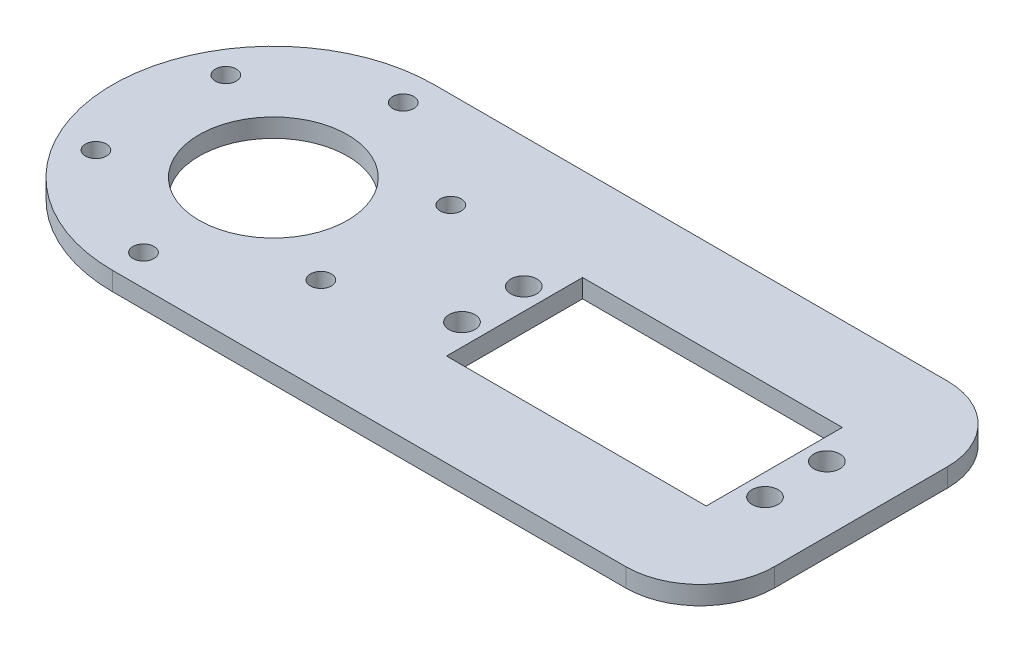
ISO-10303-21;
HEADER;
FILE_DESCRIPTION(('STEP AP214'),'2;1');
FILE_NAME('part.step','',(''),(''),'','','');
FILE_SCHEMA(('AUTOMOTIVE_DESIGN { 1 0 10303 214 1 1 1 1 }'));
ENDSEC;
DATA;
#1=APPLICATION_CONTEXT('core data for automotive mechanical design processes');
#2=APPLICATION_PROTOCOL_DEFINITION('international standard','automotive_design',2000,#1);
#3=PRODUCT_CONTEXT('',#1,'mechanical');
#4=PRODUCT('Part','Part','',(#3));
#5=PRODUCT_RELATED_PRODUCT_CATEGORY('part','',(#4));
#6=PRODUCT_DEFINITION_FORMATION('','',#4);
#7=PRODUCT_DEFINITION_CONTEXT('part definition',#1,'design');
#8=PRODUCT_DEFINITION('design','',#6,#7);
#9=PRODUCT_DEFINITION_SHAPE('','',#8);
#10=(LENGTH_UNIT() NAMED_UNIT(*) SI_UNIT(.MILLI.,.METRE.));
#11=(NAMED_UNIT(*) PLANE_ANGLE_UNIT() SI_UNIT($,.RADIAN.));
#12=(NAMED_UNIT(*) SI_UNIT($,.STERADIAN.) SOLID_ANGLE_UNIT());
#13=UNCERTAINTY_MEASURE_WITH_UNIT(LENGTH_MEASURE(1.E-05),#10,'distance_accuracy_value','');
#14=(GEOMETRIC_REPRESENTATION_CONTEXT(3) GLOBAL_UNCERTAINTY_ASSIGNED_CONTEXT((#13)) GLOBAL_UNIT_ASSIGNED_CONTEXT((#10,
#11,#12)) REPRESENTATION_CONTEXT('',''));
#15=CARTESIAN_POINT('',(0.,0.,0.));
#16=DIRECTION('',(0.,0.,1.));
#17=DIRECTION('',(1.,0.,0.));
#18=AXIS2_PLACEMENT_3D('',#15,#16,#17);
#19=CARTESIAN_POINT('',(0.,3.,0.));
#20=DIRECTION('',(0.,1.,0.));
#21=DIRECTION('',(0.,0.,1.));
#22=AXIS2_PLACEMENT_3D('',#19,#20,#21);
#23=PLANE('',#22);
#24=CARTESIAN_POINT('',(18.1865334794732,3.,-10.5));
#25=DIRECTION('',(0.,1.,0.));
#26=DIRECTION('',(0.,0.,1.));
#27=AXIS2_PLACEMENT_3D('',#24,#25,#26);
#28=CIRCLE('',#27,1.7);
#29=CARTESIAN_POINT('',(18.1865334794732,3.,-8.80000000000002));
#30=VERTEX_POINT('',#29);
#31=EDGE_CURVE('E466',#30,#30,#28,.T.);
#32=ORIENTED_EDGE('',*,*,#31,.F.);
#33=EDGE_LOOP('',(#32));
#34=FACE_BOUND('',#33,.T.);
#35=CARTESIAN_POINT('',(-18.1865334794732,3.,-10.5));
#36=DIRECTION('',(0.,1.,0.));
#37=DIRECTION('',(0.,0.,1.));
#38=AXIS2_PLACEMENT_3D('',#35,#36,#37);
#39=CIRCLE('',#38,1.7);
#40=CARTESIAN_POINT('',(-18.1865334794732,3.,-8.8));
#41=VERTEX_POINT('',#40);
#42=EDGE_CURVE('E478',#41,#41,#39,.T.);
#43=ORIENTED_EDGE('',*,*,#42,.F.);
#44=EDGE_LOOP('',(#43));
#45=FACE_BOUND('',#44,.T.);
#46=CARTESIAN_POINT('',(84.5,3.,-5.00000000000001));
#47=DIRECTION('',(0.,1.,0.));
#48=DIRECTION('',(0.,0.,-1.));
#49=AXIS2_PLACEMENT_3D('',#46,#47,#48);
#50=CIRCLE('',#49,2.1);
#51=CARTESIAN_POINT('',(84.5,3.,-7.10000000000001));
#52=VERTEX_POINT('',#51);
#53=EDGE_CURVE('E490',#52,#52,#50,.T.);
#54=ORIENTED_EDGE('',*,*,#53,.F.);
#55=EDGE_LOOP('',(#54));
#56=FACE_BOUND('',#55,.T.);
#57=DIRECTION('',(-1.,0.,0.));
#58=VECTOR('',#57,1.);
#59=CARTESIAN_POINT('',(39.,3.,-11.));
#60=LINE('',#59,#58);
#61=CARTESIAN_POINT('',(81.,3.,-11.));
#62=VERTEX_POINT('',#61);
#63=CARTESIAN_POINT('',(39.,3.,-11.));
#64=VERTEX_POINT('',#63);
#65=EDGE_CURVE('E124',#62,#64,#60,.T.);
#66=ORIENTED_EDGE('',*,*,#65,.F.);
#67=DIRECTION('',(0.,0.,-1.));
#68=VECTOR('',#67,1.);
#69=CARTESIAN_POINT('',(81.,3.,11.));
#70=LINE('',#69,#68);
#71=CARTESIAN_POINT('',(81.,3.,11.));
#72=VERTEX_POINT('',#71);
#73=EDGE_CURVE('E114',#72,#62,#70,.T.);
#74=ORIENTED_EDGE('',*,*,#73,.F.);
#75=DIRECTION('',(1.,0.,0.));
#76=VECTOR('',#75,1.);
#77=CARTESIAN_POINT('',(39.,3.,11.));
#78=LINE('',#77,#76);
#79=CARTESIAN_POINT('',(39.,3.,11.));
#80=VERTEX_POINT('',#79);
#81=EDGE_CURVE('E140',#80,#72,#78,.T.);
#82=ORIENTED_EDGE('',*,*,#81,.F.);
#83=DIRECTION('',(0.,0.,1.));
#84=VECTOR('',#83,1.);
#85=CARTESIAN_POINT('',(39.,3.,11.));
#86=LINE('',#85,#84);
#87=EDGE_CURVE('E138',#64,#80,#86,.T.);
#88=ORIENTED_EDGE('',*,*,#87,.F.);
#89=EDGE_LOOP('',(#66,#74,#82,#88));
#90=FACE_BOUND('',#89,.T.);
#91=CARTESIAN_POINT('',(35.5,3.,5.));
#92=DIRECTION('',(0.,1.,0.));
#93=DIRECTION('',(0.,0.,1.));
#94=AXIS2_PLACEMENT_3D('',#91,#92,#93);
#95=CIRCLE('',#94,2.1);
#96=CARTESIAN_POINT('',(35.5,3.,7.1));
#97=VERTEX_POINT('',#96);
#98=EDGE_CURVE('E158',#97,#97,#95,.T.);
#99=ORIENTED_EDGE('',*,*,#98,.F.);
#100=EDGE_LOOP('',(#99));
#101=FACE_BOUND('',#100,.T.);
#102=CARTESIAN_POINT('',(0.,3.,21.));
#103=DIRECTION('',(0.,1.,0.));
#104=DIRECTION('',(0.,0.,1.));
#105=AXIS2_PLACEMENT_3D('',#102,#103,#104);
#106=CIRCLE('',#105,1.7);
#107=CARTESIAN_POINT('',(0.,3.,22.7));
#108=VERTEX_POINT('',#107);
#109=EDGE_CURVE('E170',#108,#108,#106,.T.);
#110=ORIENTED_EDGE('',*,*,#109,.F.);
#111=EDGE_LOOP('',(#110));
#112=FACE_BOUND('',#111,.T.);
#113=DIRECTION('',(0.,0.,-1.));
#114=VECTOR('',#113,1.);
#115=CARTESIAN_POINT('',(95.,3.,26.));
#116=LINE('',#115,#114);
#117=CARTESIAN_POINT('',(95.,3.,14.));
#118=VERTEX_POINT('',#117);
#119=CARTESIAN_POINT('',(95.,3.,-14.));
#120=VERTEX_POINT('',#119);
#121=EDGE_CURVE('E188',#118,#120,#116,.T.);
#122=ORIENTED_EDGE('',*,*,#121,.T.);
#123=CARTESIAN_POINT('',(83.,3.,-14.));
#124=DIRECTION('',(0.,1.,0.));
#125=DIRECTION('',(0.,0.,1.));
#126=AXIS2_PLACEMENT_3D('',#123,#124,#125);
#127=CIRCLE('',#126,12.);
#128=CARTESIAN_POINT('',(83.,3.,-26.));
#129=VERTEX_POINT('',#128);
#130=EDGE_CURVE('E43',#120,#129,#127,.T.);
#131=ORIENTED_EDGE('',*,*,#130,.T.);
#132=DIRECTION('',(-1.,0.,0.));
#133=VECTOR('',#132,1.);
#134=CARTESIAN_POINT('',(0.,3.,-26.));
#135=LINE('',#134,#133);
#136=CARTESIAN_POINT('',(0.,3.,-26.));
#137=VERTEX_POINT('',#136);
#138=EDGE_CURVE('E190',#129,#137,#135,.T.);
#139=ORIENTED_EDGE('',*,*,#138,.T.);
#140=CARTESIAN_POINT('',(0.,3.,0.));
#141=DIRECTION('',(0.,1.,0.));
#142=DIRECTION('',(0.,0.,1.));
#143=AXIS2_PLACEMENT_3D('',#140,#141,#142);
#144=CIRCLE('',#143,26.);
#145=CARTESIAN_POINT('',(0.,3.,26.));
#146=VERTEX_POINT('',#145);
#147=EDGE_CURVE('E182',#137,#146,#144,.T.);
#148=ORIENTED_EDGE('',*,*,#147,.T.);
#149=DIRECTION('',(1.,0.,0.));
#150=VECTOR('',#149,1.);
#151=CARTESIAN_POINT('',(0.,3.,26.));
#152=LINE('',#151,#150);
#153=CARTESIAN_POINT('',(83.,3.,26.));
#154=VERTEX_POINT('',#153);
#155=EDGE_CURVE('E185',#146,#154,#152,.T.);
#156=ORIENTED_EDGE('',*,*,#155,.T.);
#157=CARTESIAN_POINT('',(83.,3.,14.));
#158=DIRECTION('',(0.,1.,0.));
#159=DIRECTION('',(0.,0.,1.));
#160=AXIS2_PLACEMENT_3D('',#157,#158,#159);
#161=CIRCLE('',#160,12.);
#162=EDGE_CURVE('E216',#154,#118,#161,.T.);
#163=ORIENTED_EDGE('',*,*,#162,.T.);
#164=EDGE_LOOP('',(#122,#131,#139,#148,#156,#163));
#165=FACE_BOUND('',#164,.T.);
#166=CARTESIAN_POINT('',(0.,3.,0.));
#167=DIRECTION('',(0.,1.,0.));
#168=DIRECTION('',(0.,0.,1.));
#169=AXIS2_PLACEMENT_3D('',#166,#167,#168);
#170=CIRCLE('',#169,12.);
#171=CARTESIAN_POINT('',(0.,3.,12.));
#172=VERTEX_POINT('',#171);
#173=EDGE_CURVE('E176',#172,#172,#170,.T.);
#174=ORIENTED_EDGE('',*,*,#173,.F.);
#175=EDGE_LOOP('',(#174));
#176=FACE_BOUND('',#175,.T.);
#177=CARTESIAN_POINT('',(35.5,3.,-5.));
#178=DIRECTION('',(0.,1.,0.));
#179=DIRECTION('',(0.,0.,1.));
#180=AXIS2_PLACEMENT_3D('',#177,#178,#179);
#181=CIRCLE('',#180,2.1);
#182=CARTESIAN_POINT('',(35.5,3.,-2.9));
#183=VERTEX_POINT('',#182);
#184=EDGE_CURVE('E164',#183,#183,#181,.T.);
#185=ORIENTED_EDGE('',*,*,#184,.F.);
#186=EDGE_LOOP('',(#185));
#187=FACE_BOUND('',#186,.T.);
#188=CARTESIAN_POINT('',(84.5,3.,4.99999999999999));
#189=DIRECTION('',(0.,1.,0.));
#190=DIRECTION('',(0.,0.,-1.));
#191=AXIS2_PLACEMENT_3D('',#188,#189,#190);
#192=CIRCLE('',#191,2.1);
#193=CARTESIAN_POINT('',(84.5,3.,2.89999999999999));
#194=VERTEX_POINT('',#193);
#195=EDGE_CURVE('E147',#194,#194,#192,.T.);
#196=ORIENTED_EDGE('',*,*,#195,.F.);
#197=EDGE_LOOP('',(#196));
#198=FACE_BOUND('',#197,.T.);
#199=CARTESIAN_POINT('',(-18.1865334794732,3.,10.5));
#200=DIRECTION('',(0.,1.,0.));
#201=DIRECTION('',(0.,0.,1.));
#202=AXIS2_PLACEMENT_3D('',#199,#200,#201);
#203=CIRCLE('',#202,1.7);
#204=CARTESIAN_POINT('',(-18.1865334794732,3.,12.2));
#205=VERTEX_POINT('',#204);
#206=EDGE_CURVE('E484',#205,#205,#203,.T.);
#207=ORIENTED_EDGE('',*,*,#206,.F.);
#208=EDGE_LOOP('',(#207));
#209=FACE_BOUND('',#208,.T.);
#210=CARTESIAN_POINT('',(0.,3.,-21.));
#211=DIRECTION('',(0.,1.,0.));
#212=DIRECTION('',(0.,0.,1.));
#213=AXIS2_PLACEMENT_3D('',#210,#211,#212);
#214=CIRCLE('',#213,1.7);
#215=CARTESIAN_POINT('',(0.,3.,-19.3));
#216=VERTEX_POINT('',#215);
#217=EDGE_CURVE('E472',#216,#216,#214,.T.);
#218=ORIENTED_EDGE('',*,*,#217,.F.);
#219=EDGE_LOOP('',(#218));
#220=FACE_BOUND('',#219,.T.);
#221=CARTESIAN_POINT('',(18.1865334794732,3.,10.5));
#222=DIRECTION('',(0.,1.,0.));
#223=DIRECTION('',(0.,0.,1.));
#224=AXIS2_PLACEMENT_3D('',#221,#222,#223);
#225=CIRCLE('',#224,1.7);
#226=CARTESIAN_POINT('',(18.1865334794732,3.,12.2));
#227=VERTEX_POINT('',#226);
#228=EDGE_CURVE('E457',#227,#227,#225,.T.);
#229=ORIENTED_EDGE('',*,*,#228,.F.);
#230=EDGE_LOOP('',(#229));
#231=FACE_BOUND('',#230,.T.);
#232=ADVANCED_FACE('F35',(#34,#45,#56,#90,#101,#112,#165,#176,#187,#198,#209,#220,#231),#23,.T.);
#233=CARTESIAN_POINT('',(0.,0.,0.));
#234=DIRECTION('',(0.,1.,0.));
#235=DIRECTION('',(0.,0.,1.));
#236=AXIS2_PLACEMENT_3D('',#233,#234,#235);
#237=PLANE('',#236);
#238=CARTESIAN_POINT('',(35.5,0.,5.));
#239=DIRECTION('',(0.,1.,0.));
#240=DIRECTION('',(0.,0.,1.));
#241=AXIS2_PLACEMENT_3D('',#238,#239,#240);
#242=CIRCLE('',#241,2.1);
#243=CARTESIAN_POINT('',(35.5,0.,7.1));
#244=VERTEX_POINT('',#243);
#245=EDGE_CURVE('E132',#244,#244,#242,.T.);
#246=ORIENTED_EDGE('',*,*,#245,.T.);
#247=EDGE_LOOP('',(#246));
#248=FACE_BOUND('',#247,.T.);
#249=CARTESIAN_POINT('',(35.5,0.,-5.));
#250=DIRECTION('',(0.,1.,0.));
#251=DIRECTION('',(0.,0.,1.));
#252=AXIS2_PLACEMENT_3D('',#249,#250,#251);
#253=CIRCLE('',#252,2.1);
#254=CARTESIAN_POINT('',(35.5,0.,-2.9));
#255=VERTEX_POINT('',#254);
#256=EDGE_CURVE('E161',#255,#255,#253,.T.);
#257=ORIENTED_EDGE('',*,*,#256,.T.);
#258=EDGE_LOOP('',(#257));
#259=FACE_BOUND('',#258,.T.);
#260=CARTESIAN_POINT('',(0.,0.,21.));
#261=DIRECTION('',(0.,1.,0.));
#262=DIRECTION('',(0.,0.,1.));
#263=AXIS2_PLACEMENT_3D('',#260,#261,#262);
#264=CIRCLE('',#263,1.7);
#265=CARTESIAN_POINT('',(0.,0.,22.7));
#266=VERTEX_POINT('',#265);
#267=EDGE_CURVE('E167',#266,#266,#264,.T.);
#268=ORIENTED_EDGE('',*,*,#267,.T.);
#269=EDGE_LOOP('',(#268));
#270=FACE_BOUND('',#269,.T.);
#271=CARTESIAN_POINT('',(0.,0.,0.));
#272=DIRECTION('',(0.,1.,0.));
#273=DIRECTION('',(0.,0.,1.));
#274=AXIS2_PLACEMENT_3D('',#271,#272,#273);
#275=CIRCLE('',#274,12.);
#276=CARTESIAN_POINT('',(0.,0.,12.));
#277=VERTEX_POINT('',#276);
#278=EDGE_CURVE('E173',#277,#277,#275,.T.);
#279=ORIENTED_EDGE('',*,*,#278,.T.);
#280=EDGE_LOOP('',(#279));
#281=FACE_BOUND('',#280,.T.);
#282=DIRECTION('',(-1.,0.,0.));
#283=VECTOR('',#282,1.);
#284=CARTESIAN_POINT('',(0.,0.,-26.));
#285=LINE('',#284,#283);
#286=CARTESIAN_POINT('',(83.,0.,-26.));
#287=VERTEX_POINT('',#286);
#288=CARTESIAN_POINT('',(0.,0.,-26.));
#289=VERTEX_POINT('',#288);
#290=EDGE_CURVE('E186',#287,#289,#285,.T.);
#291=ORIENTED_EDGE('',*,*,#290,.F.);
#292=CARTESIAN_POINT('',(83.,0.,-14.));
#293=DIRECTION('',(0.,1.,0.));
#294=DIRECTION('',(0.,0.,1.));
#295=AXIS2_PLACEMENT_3D('',#292,#293,#294);
#296=CIRCLE('',#295,12.);
#297=CARTESIAN_POINT('',(95.,0.,-14.));
#298=VERTEX_POINT('',#297);
#299=EDGE_CURVE('E210',#287,#298,#296,.F.);
#300=ORIENTED_EDGE('',*,*,#299,.T.);
#301=DIRECTION('',(0.,0.,-1.));
#302=VECTOR('',#301,1.);
#303=CARTESIAN_POINT('',(95.,0.,26.));
#304=LINE('',#303,#302);
#305=CARTESIAN_POINT('',(95.,0.,14.));
#306=VERTEX_POINT('',#305);
#307=EDGE_CURVE('E197',#306,#298,#304,.T.);
#308=ORIENTED_EDGE('',*,*,#307,.F.);
#309=CARTESIAN_POINT('',(83.,0.,14.));
#310=DIRECTION('',(0.,1.,0.));
#311=DIRECTION('',(0.,0.,1.));
#312=AXIS2_PLACEMENT_3D('',#309,#310,#311);
#313=CIRCLE('',#312,12.);
#314=CARTESIAN_POINT('',(83.,0.,26.));
#315=VERTEX_POINT('',#314);
#316=EDGE_CURVE('E208',#306,#315,#313,.F.);
#317=ORIENTED_EDGE('',*,*,#316,.T.);
#318=DIRECTION('',(1.,0.,0.));
#319=VECTOR('',#318,1.);
#320=CARTESIAN_POINT('',(0.,0.,26.));
#321=LINE('',#320,#319);
#322=CARTESIAN_POINT('',(0.,0.,26.));
#323=VERTEX_POINT('',#322);
#324=EDGE_CURVE('E195',#323,#315,#321,.T.);
#325=ORIENTED_EDGE('',*,*,#324,.F.);
#326=CARTESIAN_POINT('',(0.,0.,0.));
#327=DIRECTION('',(0.,1.,0.));
#328=DIRECTION('',(0.,0.,1.));
#329=AXIS2_PLACEMENT_3D('',#326,#327,#328);
#330=CIRCLE('',#329,26.);
#331=EDGE_CURVE('E179',#289,#323,#330,.T.);
#332=ORIENTED_EDGE('',*,*,#331,.F.);
#333=EDGE_LOOP('',(#291,#300,#308,#317,#325,#332));
#334=FACE_BOUND('',#333,.T.);
#335=DIRECTION('',(0.,0.,-1.));
#336=VECTOR('',#335,1.);
#337=CARTESIAN_POINT('',(81.,0.,11.));
#338=LINE('',#337,#336);
#339=CARTESIAN_POINT('',(81.,0.,11.));
#340=VERTEX_POINT('',#339);
#341=CARTESIAN_POINT('',(81.,0.,-11.));
#342=VERTEX_POINT('',#341);
#343=EDGE_CURVE('E145',#340,#342,#338,.T.);
#344=ORIENTED_EDGE('',*,*,#343,.T.);
#345=DIRECTION('',(-1.,0.,0.));
#346=VECTOR('',#345,1.);
#347=CARTESIAN_POINT('',(39.,0.,-11.));
#348=LINE('',#347,#346);
#349=CARTESIAN_POINT('',(39.,0.,-11.));
#350=VERTEX_POINT('',#349);
#351=EDGE_CURVE('E131',#342,#350,#348,.T.);
#352=ORIENTED_EDGE('',*,*,#351,.T.);
#353=DIRECTION('',(0.,0.,1.));
#354=VECTOR('',#353,1.);
#355=CARTESIAN_POINT('',(39.,0.,11.));
#356=LINE('',#355,#354);
#357=CARTESIAN_POINT('',(39.,0.,11.));
#358=VERTEX_POINT('',#357);
#359=EDGE_CURVE('E149',#350,#358,#356,.T.);
#360=ORIENTED_EDGE('',*,*,#359,.T.);
#361=DIRECTION('',(1.,0.,0.));
#362=VECTOR('',#361,1.);
#363=CARTESIAN_POINT('',(39.,0.,11.));
#364=LINE('',#363,#362);
#365=EDGE_CURVE('E125',#358,#340,#364,.T.);
#366=ORIENTED_EDGE('',*,*,#365,.T.);
#367=EDGE_LOOP('',(#344,#352,#360,#366));
#368=FACE_BOUND('',#367,.T.);
#369=CARTESIAN_POINT('',(84.5,0.,4.99999999999999));
#370=DIRECTION('',(0.,1.,0.));
#371=DIRECTION('',(0.,0.,-1.));
#372=AXIS2_PLACEMENT_3D('',#369,#370,#371);
#373=CIRCLE('',#372,2.1);
#374=CARTESIAN_POINT('',(84.5,0.,2.89999999999999));
#375=VERTEX_POINT('',#374);
#376=EDGE_CURVE('E493',#375,#375,#373,.T.);
#377=ORIENTED_EDGE('',*,*,#376,.T.);
#378=EDGE_LOOP('',(#377));
#379=FACE_BOUND('',#378,.T.);
#380=CARTESIAN_POINT('',(84.5,0.,-5.00000000000001));
#381=DIRECTION('',(0.,1.,0.));
#382=DIRECTION('',(0.,0.,-1.));
#383=AXIS2_PLACEMENT_3D('',#380,#381,#382);
#384=CIRCLE('',#383,2.1);
#385=CARTESIAN_POINT('',(84.5,0.,-7.10000000000001));
#386=VERTEX_POINT('',#385);
#387=EDGE_CURVE('E487',#386,#386,#384,.T.);
#388=ORIENTED_EDGE('',*,*,#387,.T.);
#389=EDGE_LOOP('',(#388));
#390=FACE_BOUND('',#389,.T.);
#391=CARTESIAN_POINT('',(-18.1865334794732,0.,10.5));
#392=DIRECTION('',(0.,1.,0.));
#393=DIRECTION('',(0.,0.,1.));
#394=AXIS2_PLACEMENT_3D('',#391,#392,#393);
#395=CIRCLE('',#394,1.7);
#396=CARTESIAN_POINT('',(-18.1865334794732,0.,12.2));
#397=VERTEX_POINT('',#396);
#398=EDGE_CURVE('E481',#397,#397,#395,.T.);
#399=ORIENTED_EDGE('',*,*,#398,.T.);
#400=EDGE_LOOP('',(#399));
#401=FACE_BOUND('',#400,.T.);
#402=CARTESIAN_POINT('',(-18.1865334794732,0.,-10.5));
#403=DIRECTION('',(0.,1.,0.));
#404=DIRECTION('',(0.,0.,1.));
#405=AXIS2_PLACEMENT_3D('',#402,#403,#404);
#406=CIRCLE('',#405,1.7);
#407=CARTESIAN_POINT('',(-18.1865334794732,0.,-8.8));
#408=VERTEX_POINT('',#407);
#409=EDGE_CURVE('E475',#408,#408,#406,.T.);
#410=ORIENTED_EDGE('',*,*,#409,.T.);
#411=EDGE_LOOP('',(#410));
#412=FACE_BOUND('',#411,.T.);
#413=CARTESIAN_POINT('',(0.,0.,-21.));
#414=DIRECTION('',(0.,1.,0.));
#415=DIRECTION('',(0.,0.,1.));
#416=AXIS2_PLACEMENT_3D('',#413,#414,#415);
#417=CIRCLE('',#416,1.7);
#418=CARTESIAN_POINT('',(0.,0.,-19.3));
#419=VERTEX_POINT('',#418);
#420=EDGE_CURVE('E469',#419,#419,#417,.T.);
#421=ORIENTED_EDGE('',*,*,#420,.T.);
#422=EDGE_LOOP('',(#421));
#423=FACE_BOUND('',#422,.T.);
#424=CARTESIAN_POINT('',(18.1865334794732,0.,-10.5));
#425=DIRECTION('',(0.,1.,0.));
#426=DIRECTION('',(0.,0.,1.));
#427=AXIS2_PLACEMENT_3D('',#424,#425,#426);
#428=CIRCLE('',#427,1.7);
#429=CARTESIAN_POINT('',(18.1865334794732,0.,-8.80000000000002));
#430=VERTEX_POINT('',#429);
#431=EDGE_CURVE('E463',#430,#430,#428,.T.);
#432=ORIENTED_EDGE('',*,*,#431,.T.);
#433=EDGE_LOOP('',(#432));
#434=FACE_BOUND('',#433,.T.);
#435=CARTESIAN_POINT('',(18.1865334794732,0.,10.5));
#436=DIRECTION('',(0.,1.,0.));
#437=DIRECTION('',(0.,0.,1.));
#438=AXIS2_PLACEMENT_3D('',#435,#436,#437);
#439=CIRCLE('',#438,1.7);
#440=CARTESIAN_POINT('',(18.1865334794732,0.,12.2));
#441=VERTEX_POINT('',#440);
#442=EDGE_CURVE('E460',#441,#441,#439,.T.);
#443=ORIENTED_EDGE('',*,*,#442,.T.);
#444=EDGE_LOOP('',(#443));
#445=FACE_BOUND('',#444,.T.);
#446=ADVANCED_FACE('F231',(#248,#259,#270,#281,#334,#368,#379,#390,#401,#412,#423,#434,#445),
#237,.F.);
#447=CARTESIAN_POINT('',(0.,3.,0.));
#448=DIRECTION('',(0.,-1.,0.));
#449=DIRECTION('',(0.,0.,-1.));
#450=AXIS2_PLACEMENT_3D('',#447,#448,#449);
#451=CYLINDRICAL_SURFACE('',#450,26.);
#452=ORIENTED_EDGE('',*,*,#331,.T.);
#453=DIRECTION('',(0.,-1.,0.));
#454=VECTOR('',#453,1.);
#455=CARTESIAN_POINT('',(0.,3.,26.));
#456=LINE('',#455,#454);
#457=EDGE_CURVE('E202',#146,#323,#456,.T.);
#458=ORIENTED_EDGE('',*,*,#457,.F.);
#459=ORIENTED_EDGE('',*,*,#147,.F.);
#460=DIRECTION('',(0.,-1.,0.));
#461=VECTOR('',#460,1.);
#462=CARTESIAN_POINT('',(0.,3.,-26.));
#463=LINE('',#462,#461);
#464=EDGE_CURVE('E192',#137,#289,#463,.T.);
#465=ORIENTED_EDGE('',*,*,#464,.T.);
#466=EDGE_LOOP('',(#452,#458,#459,#465));
#467=FACE_BOUND('',#466,.T.);
#468=ADVANCED_FACE('F241',(#467),#451,.T.);
#469=CARTESIAN_POINT('',(0.,3.,26.));
#470=DIRECTION('',(0.,0.,-1.));
#471=DIRECTION('',(-1.,0.,0.));
#472=AXIS2_PLACEMENT_3D('',#469,#470,#471);
#473=PLANE('',#472);
#474=ORIENTED_EDGE('',*,*,#324,.T.);
#475=DIRECTION('',(0.,-1.,0.));
#476=VECTOR('',#475,1.);
#477=CARTESIAN_POINT('',(83.,3.,26.));
#478=LINE('',#477,#476);
#479=EDGE_CURVE('E11',#315,#154,#478,.F.);
#480=ORIENTED_EDGE('',*,*,#479,.T.);
#481=ORIENTED_EDGE('',*,*,#155,.F.);
#482=ORIENTED_EDGE('',*,*,#457,.T.);
#483=EDGE_LOOP('',(#474,#480,#481,#482));
#484=FACE_BOUND('',#483,.T.);
#485=ADVANCED_FACE('F238',(#484),#473,.F.);
#486=CARTESIAN_POINT('',(95.,3.,26.));
#487=DIRECTION('',(-1.,0.,0.));
#488=DIRECTION('',(0.,0.,1.));
#489=AXIS2_PLACEMENT_3D('',#486,#487,#488);
#490=PLANE('',#489);
#491=ORIENTED_EDGE('',*,*,#307,.T.);
#492=DIRECTION('',(0.,-1.,0.));
#493=VECTOR('',#492,1.);
#494=CARTESIAN_POINT('',(95.,3.,-14.));
#495=LINE('',#494,#493);
#496=EDGE_CURVE('E56',#298,#120,#495,.F.);
#497=ORIENTED_EDGE('',*,*,#496,.T.);
#498=ORIENTED_EDGE('',*,*,#121,.F.);
#499=DIRECTION('',(0.,-1.,0.));
#500=VECTOR('',#499,1.);
#501=CARTESIAN_POINT('',(95.,3.,14.));
#502=LINE('',#501,#500);
#503=EDGE_CURVE('E212',#118,#306,#502,.T.);
#504=ORIENTED_EDGE('',*,*,#503,.T.);
#505=EDGE_LOOP('',(#491,#497,#498,#504));
#506=FACE_BOUND('',#505,.T.);
#507=ADVANCED_FACE('F234',(#506),#490,.F.);
#508=CARTESIAN_POINT('',(0.,3.,-26.));
#509=DIRECTION('',(0.,0.,1.));
#510=DIRECTION('',(1.,0.,0.));
#511=AXIS2_PLACEMENT_3D('',#508,#509,#510);
#512=PLANE('',#511);
#513=ORIENTED_EDGE('',*,*,#138,.F.);
#514=DIRECTION('',(0.,-1.,0.));
#515=VECTOR('',#514,1.);
#516=CARTESIAN_POINT('',(83.,3.,-26.));
#517=LINE('',#516,#515);
#518=EDGE_CURVE('E205',#129,#287,#517,.T.);
#519=ORIENTED_EDGE('',*,*,#518,.T.);
#520=ORIENTED_EDGE('',*,*,#290,.T.);
#521=ORIENTED_EDGE('',*,*,#464,.F.);
#522=EDGE_LOOP('',(#513,#519,#520,#521));
#523=FACE_BOUND('',#522,.T.);
#524=ADVANCED_FACE('F225',(#523),#512,.F.);
#525=CARTESIAN_POINT('',(0.,3.,0.));
#526=DIRECTION('',(0.,-1.,0.));
#527=DIRECTION('',(0.,0.,-1.));
#528=AXIS2_PLACEMENT_3D('',#525,#526,#527);
#529=CYLINDRICAL_SURFACE('',#528,12.);
#530=ORIENTED_EDGE('',*,*,#173,.T.);
#531=EDGE_LOOP('',(#530));
#532=FACE_BOUND('',#531,.T.);
#533=ORIENTED_EDGE('',*,*,#278,.F.);
#534=EDGE_LOOP('',(#533));
#535=FACE_BOUND('',#534,.T.);
#536=ADVANCED_FACE('F259',(#532,#535),#529,.F.);
#537=CARTESIAN_POINT('',(0.,3.,21.));
#538=DIRECTION('',(0.,-1.,0.));
#539=DIRECTION('',(0.,0.,-1.));
#540=AXIS2_PLACEMENT_3D('',#537,#538,#539);
#541=CYLINDRICAL_SURFACE('',#540,1.7);
#542=ORIENTED_EDGE('',*,*,#109,.T.);
#543=EDGE_LOOP('',(#542));
#544=FACE_BOUND('',#543,.T.);
#545=ORIENTED_EDGE('',*,*,#267,.F.);
#546=EDGE_LOOP('',(#545));
#547=FACE_BOUND('',#546,.T.);
#548=ADVANCED_FACE('F280',(#544,#547),#541,.F.);
#549=CARTESIAN_POINT('',(35.5,3.,-5.));
#550=DIRECTION('',(0.,-1.,0.));
#551=DIRECTION('',(0.,0.,-1.));
#552=AXIS2_PLACEMENT_3D('',#549,#550,#551);
#553=CYLINDRICAL_SURFACE('',#552,2.1);
#554=ORIENTED_EDGE('',*,*,#184,.T.);
#555=EDGE_LOOP('',(#554));
#556=FACE_BOUND('',#555,.T.);
#557=ORIENTED_EDGE('',*,*,#256,.F.);
#558=EDGE_LOOP('',(#557));
#559=FACE_BOUND('',#558,.T.);
#560=ADVANCED_FACE('F287',(#556,#559),#553,.F.);
#561=CARTESIAN_POINT('',(35.5,3.,5.));
#562=DIRECTION('',(0.,-1.,0.));
#563=DIRECTION('',(0.,0.,-1.));
#564=AXIS2_PLACEMENT_3D('',#561,#562,#563);
#565=CYLINDRICAL_SURFACE('',#564,2.1);
#566=ORIENTED_EDGE('',*,*,#98,.T.);
#567=EDGE_LOOP('',(#566));
#568=FACE_BOUND('',#567,.T.);
#569=ORIENTED_EDGE('',*,*,#245,.F.);
#570=EDGE_LOOP('',(#569));
#571=FACE_BOUND('',#570,.T.);
#572=ADVANCED_FACE('F294',(#568,#571),#565,.F.);
#573=CARTESIAN_POINT('',(81.,3.,11.));
#574=DIRECTION('',(-1.,0.,0.));
#575=DIRECTION('',(0.,0.,1.));
#576=AXIS2_PLACEMENT_3D('',#573,#574,#575);
#577=PLANE('',#576);
#578=ORIENTED_EDGE('',*,*,#343,.F.);
#579=DIRECTION('',(0.,-1.,0.));
#580=VECTOR('',#579,1.);
#581=CARTESIAN_POINT('',(81.,3.,11.));
#582=LINE('',#581,#580);
#583=EDGE_CURVE('E120',#72,#340,#582,.T.);
#584=ORIENTED_EDGE('',*,*,#583,.F.);
#585=ORIENTED_EDGE('',*,*,#73,.T.);
#586=DIRECTION('',(0.,-1.,0.));
#587=VECTOR('',#586,1.);
#588=CARTESIAN_POINT('',(81.,3.,-11.));
#589=LINE('',#588,#587);
#590=EDGE_CURVE('E117',#62,#342,#589,.T.);
#591=ORIENTED_EDGE('',*,*,#590,.T.);
#592=EDGE_LOOP('',(#578,#584,#585,#591));
#593=FACE_BOUND('',#592,.T.);
#594=ADVANCED_FACE('F116',(#593),#577,.T.);
#595=CARTESIAN_POINT('',(39.,3.,-11.));
#596=DIRECTION('',(0.,0.,1.));
#597=DIRECTION('',(1.,0.,0.));
#598=AXIS2_PLACEMENT_3D('',#595,#596,#597);
#599=PLANE('',#598);
#600=ORIENTED_EDGE('',*,*,#351,.F.);
#601=ORIENTED_EDGE('',*,*,#590,.F.);
#602=ORIENTED_EDGE('',*,*,#65,.T.);
#603=DIRECTION('',(0.,-1.,0.));
#604=VECTOR('',#603,1.);
#605=CARTESIAN_POINT('',(39.,3.,-11.));
#606=LINE('',#605,#604);
#607=EDGE_CURVE('E133',#64,#350,#606,.T.);
#608=ORIENTED_EDGE('',*,*,#607,.T.);
#609=EDGE_LOOP('',(#600,#601,#602,#608));
#610=FACE_BOUND('',#609,.T.);
#611=ADVANCED_FACE('F128',(#610),#599,.T.);
#612=CARTESIAN_POINT('',(39.,3.,11.));
#613=DIRECTION('',(1.,0.,0.));
#614=DIRECTION('',(0.,0.,-1.));
#615=AXIS2_PLACEMENT_3D('',#612,#613,#614);
#616=PLANE('',#615);
#617=ORIENTED_EDGE('',*,*,#359,.F.);
#618=ORIENTED_EDGE('',*,*,#607,.F.);
#619=ORIENTED_EDGE('',*,*,#87,.T.);
#620=DIRECTION('',(0.,-1.,0.));
#621=VECTOR('',#620,1.);
#622=CARTESIAN_POINT('',(39.,3.,11.));
#623=LINE('',#622,#621);
#624=EDGE_CURVE('E155',#80,#358,#623,.T.);
#625=ORIENTED_EDGE('',*,*,#624,.T.);
#626=EDGE_LOOP('',(#617,#618,#619,#625));
#627=FACE_BOUND('',#626,.T.);
#628=ADVANCED_FACE('F315',(#627),#616,.T.);
#629=CARTESIAN_POINT('',(39.,3.,11.));
#630=DIRECTION('',(0.,0.,-1.));
#631=DIRECTION('',(-1.,0.,0.));
#632=AXIS2_PLACEMENT_3D('',#629,#630,#631);
#633=PLANE('',#632);
#634=ORIENTED_EDGE('',*,*,#365,.F.);
#635=ORIENTED_EDGE('',*,*,#624,.F.);
#636=ORIENTED_EDGE('',*,*,#81,.T.);
#637=ORIENTED_EDGE('',*,*,#583,.T.);
#638=EDGE_LOOP('',(#634,#635,#636,#637));
#639=FACE_BOUND('',#638,.T.);
#640=ADVANCED_FACE('F322',(#639),#633,.T.);
#641=CARTESIAN_POINT('',(84.5,3.,4.99999999999999));
#642=DIRECTION('',(0.,-1.,0.));
#643=DIRECTION('',(0.,0.,-1.));
#644=AXIS2_PLACEMENT_3D('',#641,#642,#643);
#645=CYLINDRICAL_SURFACE('',#644,2.1);
#646=ORIENTED_EDGE('',*,*,#195,.T.);
#647=EDGE_LOOP('',(#646));
#648=FACE_BOUND('',#647,.T.);
#649=ORIENTED_EDGE('',*,*,#376,.F.);
#650=EDGE_LOOP('',(#649));
#651=FACE_BOUND('',#650,.T.);
#652=ADVANCED_FACE('F330',(#648,#651),#645,.F.);
#653=CARTESIAN_POINT('',(84.5,3.,-5.00000000000001));
#654=DIRECTION('',(0.,-1.,0.));
#655=DIRECTION('',(0.,0.,-1.));
#656=AXIS2_PLACEMENT_3D('',#653,#654,#655);
#657=CYLINDRICAL_SURFACE('',#656,2.1);
#658=ORIENTED_EDGE('',*,*,#53,.T.);
#659=EDGE_LOOP('',(#658));
#660=FACE_BOUND('',#659,.T.);
#661=ORIENTED_EDGE('',*,*,#387,.F.);
#662=EDGE_LOOP('',(#661));
#663=FACE_BOUND('',#662,.T.);
#664=ADVANCED_FACE('F338',(#660,#663),#657,.F.);
#665=CARTESIAN_POINT('',(-18.1865334794732,3.,10.5));
#666=DIRECTION('',(0.,-1.,0.));
#667=DIRECTION('',(0.,0.,-1.));
#668=AXIS2_PLACEMENT_3D('',#665,#666,#667);
#669=CYLINDRICAL_SURFACE('',#668,1.7);
#670=ORIENTED_EDGE('',*,*,#206,.T.);
#671=EDGE_LOOP('',(#670));
#672=FACE_BOUND('',#671,.T.);
#673=ORIENTED_EDGE('',*,*,#398,.F.);
#674=EDGE_LOOP('',(#673));
#675=FACE_BOUND('',#674,.T.);
#676=ADVANCED_FACE('F346',(#672,#675),#669,.F.);
#677=CARTESIAN_POINT('',(-18.1865334794732,3.,-10.5));
#678=DIRECTION('',(0.,-1.,0.));
#679=DIRECTION('',(0.,0.,-1.));
#680=AXIS2_PLACEMENT_3D('',#677,#678,#679);
#681=CYLINDRICAL_SURFACE('',#680,1.7);
#682=ORIENTED_EDGE('',*,*,#42,.T.);
#683=EDGE_LOOP('',(#682));
#684=FACE_BOUND('',#683,.T.);
#685=ORIENTED_EDGE('',*,*,#409,.F.);
#686=EDGE_LOOP('',(#685));
#687=FACE_BOUND('',#686,.T.);
#688=ADVANCED_FACE('F354',(#684,#687),#681,.F.);
#689=CARTESIAN_POINT('',(0.,3.,-21.));
#690=DIRECTION('',(0.,-1.,0.));
#691=DIRECTION('',(0.,0.,-1.));
#692=AXIS2_PLACEMENT_3D('',#689,#690,#691);
#693=CYLINDRICAL_SURFACE('',#692,1.7);
#694=ORIENTED_EDGE('',*,*,#217,.T.);
#695=EDGE_LOOP('',(#694));
#696=FACE_BOUND('',#695,.T.);
#697=ORIENTED_EDGE('',*,*,#420,.F.);
#698=EDGE_LOOP('',(#697));
#699=FACE_BOUND('',#698,.T.);
#700=ADVANCED_FACE('F362',(#696,#699),#693,.F.);
#701=CARTESIAN_POINT('',(18.1865334794732,3.,-10.5));
#702=DIRECTION('',(0.,-1.,0.));
#703=DIRECTION('',(0.,0.,-1.));
#704=AXIS2_PLACEMENT_3D('',#701,#702,#703);
#705=CYLINDRICAL_SURFACE('',#704,1.7);
#706=ORIENTED_EDGE('',*,*,#31,.T.);
#707=EDGE_LOOP('',(#706));
#708=FACE_BOUND('',#707,.T.);
#709=ORIENTED_EDGE('',*,*,#431,.F.);
#710=EDGE_LOOP('',(#709));
#711=FACE_BOUND('',#710,.T.);
#712=ADVANCED_FACE('F370',(#708,#711),#705,.F.);
#713=CARTESIAN_POINT('',(18.1865334794732,3.,10.5));
#714=DIRECTION('',(0.,-1.,0.));
#715=DIRECTION('',(0.,0.,-1.));
#716=AXIS2_PLACEMENT_3D('',#713,#714,#715);
#717=CYLINDRICAL_SURFACE('',#716,1.7);
#718=ORIENTED_EDGE('',*,*,#228,.T.);
#719=EDGE_LOOP('',(#718));
#720=FACE_BOUND('',#719,.T.);
#721=ORIENTED_EDGE('',*,*,#442,.F.);
#722=EDGE_LOOP('',(#721));
#723=FACE_BOUND('',#722,.T.);
#724=ADVANCED_FACE('F378',(#720,#723),#717,.F.);
#725=CARTESIAN_POINT('',(83.,3.,-14.));
#726=DIRECTION('',(0.,-1.,0.));
#727=DIRECTION('',(0.,0.,-1.));
#728=AXIS2_PLACEMENT_3D('',#725,#726,#727);
#729=CYLINDRICAL_SURFACE('',#728,12.);
#730=ORIENTED_EDGE('',*,*,#130,.F.);
#731=ORIENTED_EDGE('',*,*,#496,.F.);
#732=ORIENTED_EDGE('',*,*,#299,.F.);
#733=ORIENTED_EDGE('',*,*,#518,.F.);
#734=EDGE_LOOP('',(#730,#731,#732,#733));
#735=FACE_BOUND('',#734,.T.);
#736=ADVANCED_FACE('F228',(#735),#729,.T.);
#737=CARTESIAN_POINT('',(83.,3.,14.));
#738=DIRECTION('',(0.,-1.,0.));
#739=DIRECTION('',(0.,0.,-1.));
#740=AXIS2_PLACEMENT_3D('',#737,#738,#739);
#741=CYLINDRICAL_SURFACE('',#740,12.);
#742=ORIENTED_EDGE('',*,*,#162,.F.);
#743=ORIENTED_EDGE('',*,*,#479,.F.);
#744=ORIENTED_EDGE('',*,*,#316,.F.);
#745=ORIENTED_EDGE('',*,*,#503,.F.);
#746=EDGE_LOOP('',(#742,#743,#744,#745));
#747=FACE_BOUND('',#746,.T.);
#748=ADVANCED_FACE('F37',(#747),#741,.T.);
#749=CLOSED_SHELL('',(#232,#446,#468,#485,#507,#524,#536,#548,#560,#572,#594,#611,#628,#640,
#652,#664,#676,#688,#700,#712,#724,#736,#748));
#750=MANIFOLD_SOLID_BREP('B2',#749);
#751=ADVANCED_BREP_SHAPE_REPRESENTATION('',(#18,#750),#14);
#752=SHAPE_DEFINITION_REPRESENTATION(#9,#751);
ENDSEC;
END-ISO-10303-21;
